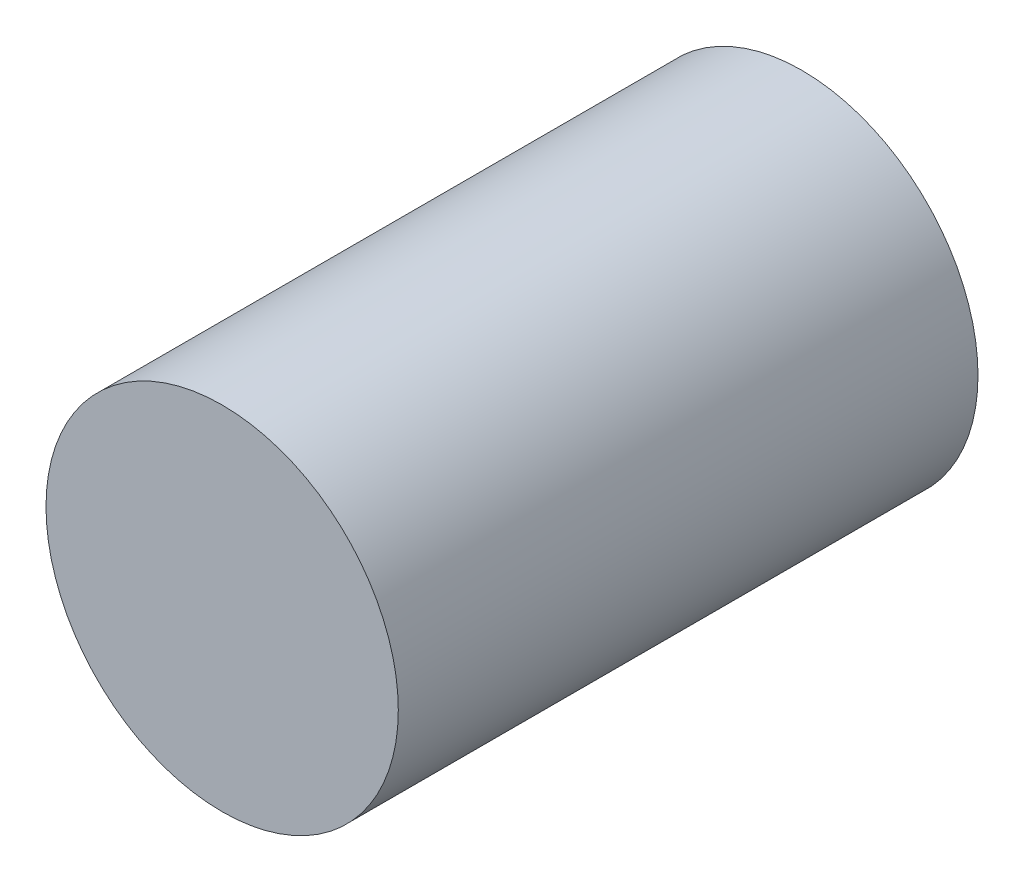
ISO-10303-21;
HEADER;
FILE_DESCRIPTION(('STEP AP214'),'2;1');
FILE_NAME('part.step','',(''),(''),'','','');
FILE_SCHEMA(('AUTOMOTIVE_DESIGN { 1 0 10303 214 1 1 1 1 }'));
ENDSEC;
DATA;
#1=APPLICATION_CONTEXT('core data for automotive mechanical design processes');
#2=APPLICATION_PROTOCOL_DEFINITION('international standard','automotive_design',2000,#1);
#3=PRODUCT_CONTEXT('',#1,'mechanical');
#4=PRODUCT('Part','Part','',(#3));
#5=PRODUCT_RELATED_PRODUCT_CATEGORY('part','',(#4));
#6=PRODUCT_DEFINITION_FORMATION('','',#4);
#7=PRODUCT_DEFINITION_CONTEXT('part definition',#1,'design');
#8=PRODUCT_DEFINITION('design','',#6,#7);
#9=PRODUCT_DEFINITION_SHAPE('','',#8);
#10=(LENGTH_UNIT() NAMED_UNIT(*) SI_UNIT(.MILLI.,.METRE.));
#11=(NAMED_UNIT(*) PLANE_ANGLE_UNIT() SI_UNIT($,.RADIAN.));
#12=(NAMED_UNIT(*) SI_UNIT($,.STERADIAN.) SOLID_ANGLE_UNIT());
#13=UNCERTAINTY_MEASURE_WITH_UNIT(LENGTH_MEASURE(1.E-05),#10,'distance_accuracy_value','');
#14=(GEOMETRIC_REPRESENTATION_CONTEXT(3) GLOBAL_UNCERTAINTY_ASSIGNED_CONTEXT((#13)) GLOBAL_UNIT_ASSIGNED_CONTEXT((#10,
#11,#12)) REPRESENTATION_CONTEXT('',''));
#15=CARTESIAN_POINT('',(0.,0.,0.));
#16=DIRECTION('',(0.,0.,1.));
#17=DIRECTION('',(1.,0.,0.));
#18=AXIS2_PLACEMENT_3D('',#15,#16,#17);
#19=CARTESIAN_POINT('',(0.,0.,36.2));
#20=DIRECTION('',(0.,0.,-1.));
#21=DIRECTION('',(-1.,0.,0.));
#22=AXIS2_PLACEMENT_3D('',#19,#20,#21);
#23=CYLINDRICAL_SURFACE('',#22,11.);
#24=CARTESIAN_POINT('',(0.,0.,36.2));
#25=DIRECTION('',(0.,0.,1.));
#26=DIRECTION('',(1.,0.,0.));
#27=AXIS2_PLACEMENT_3D('',#24,#25,#26);
#28=CIRCLE('',#27,11.);
#29=CARTESIAN_POINT('',(-11.,0.,36.2));
#30=VERTEX_POINT('',#29);
#31=EDGE_CURVE('E10',#30,#30,#28,.T.);
#32=CARTESIAN_POINT('',(0.,0.,0.));
#33=DIRECTION('',(0.,0.,1.));
#34=DIRECTION('',(1.,0.,0.));
#35=AXIS2_PLACEMENT_3D('',#32,#33,#34);
#36=CIRCLE('',#35,11.);
#37=CARTESIAN_POINT('',(-11.,0.,0.));
#38=VERTEX_POINT('',#37);
#39=EDGE_CURVE('E42',#38,#38,#36,.T.);
#40=CARTESIAN_POINT('',(-11.,0.,36.2));
#41=CARTESIAN_POINT('',(-11.,0.,35.8229166666667));
#42=CARTESIAN_POINT('',(-11.,0.,35.4458333333333));
#43=CARTESIAN_POINT('',(-11.,0.,34.6916666666667));
#44=CARTESIAN_POINT('',(-11.,0.,34.3145833333333));
#45=CARTESIAN_POINT('',(-11.,0.,33.5604166666667));
#46=CARTESIAN_POINT('',(-11.,0.,33.1833333333333));
#47=CARTESIAN_POINT('',(-11.,0.,32.4291666666667));
#48=CARTESIAN_POINT('',(-11.,0.,32.0520833333333));
#49=CARTESIAN_POINT('',(-11.,0.,31.2979166666667));
#50=CARTESIAN_POINT('',(-11.,0.,30.9208333333333));
#51=CARTESIAN_POINT('',(-11.,0.,30.1666666666667));
#52=CARTESIAN_POINT('',(-11.,0.,29.7895833333333));
#53=CARTESIAN_POINT('',(-11.,0.,29.0354166666667));
#54=CARTESIAN_POINT('',(-11.,0.,28.6583333333333));
#55=CARTESIAN_POINT('',(-11.,0.,27.9041666666667));
#56=CARTESIAN_POINT('',(-11.,0.,27.5270833333333));
#57=CARTESIAN_POINT('',(-11.,0.,26.7729166666667));
#58=CARTESIAN_POINT('',(-11.,0.,26.3958333333333));
#59=CARTESIAN_POINT('',(-11.,0.,25.6416666666667));
#60=CARTESIAN_POINT('',(-11.,0.,25.2645833333333));
#61=CARTESIAN_POINT('',(-11.,0.,24.5104166666667));
#62=CARTESIAN_POINT('',(-11.,0.,24.1333333333333));
#63=CARTESIAN_POINT('',(-11.,0.,23.3791666666667));
#64=CARTESIAN_POINT('',(-11.,0.,23.0020833333333));
#65=CARTESIAN_POINT('',(-11.,0.,22.2479166666667));
#66=CARTESIAN_POINT('',(-11.,0.,21.8708333333333));
#67=CARTESIAN_POINT('',(-11.,0.,21.1166666666667));
#68=CARTESIAN_POINT('',(-11.,0.,20.7395833333333));
#69=CARTESIAN_POINT('',(-11.,0.,19.9854166666667));
#70=CARTESIAN_POINT('',(-11.,0.,19.6083333333333));
#71=CARTESIAN_POINT('',(-11.,0.,18.8541666666667));
#72=CARTESIAN_POINT('',(-11.,0.,18.4770833333333));
#73=CARTESIAN_POINT('',(-11.,0.,17.7229166666667));
#74=CARTESIAN_POINT('',(-11.,0.,17.3458333333333));
#75=CARTESIAN_POINT('',(-11.,0.,16.5916666666667));
#76=CARTESIAN_POINT('',(-11.,0.,16.2145833333333));
#77=CARTESIAN_POINT('',(-11.,0.,15.4604166666667));
#78=CARTESIAN_POINT('',(-11.,0.,15.0833333333333));
#79=CARTESIAN_POINT('',(-11.,0.,14.3291666666667));
#80=CARTESIAN_POINT('',(-11.,0.,13.9520833333333));
#81=CARTESIAN_POINT('',(-11.,0.,13.1979166666667));
#82=CARTESIAN_POINT('',(-11.,0.,12.8208333333333));
#83=CARTESIAN_POINT('',(-11.,0.,12.0666666666667));
#84=CARTESIAN_POINT('',(-11.,0.,11.6895833333333));
#85=CARTESIAN_POINT('',(-11.,0.,10.9354166666667));
#86=CARTESIAN_POINT('',(-11.,0.,10.5583333333333));
#87=CARTESIAN_POINT('',(-11.,0.,9.80416666666666));
#88=CARTESIAN_POINT('',(-11.,0.,9.42708333333333));
#89=CARTESIAN_POINT('',(-11.,0.,8.67291666666666));
#90=CARTESIAN_POINT('',(-11.,0.,8.29583333333333));
#91=CARTESIAN_POINT('',(-11.,0.,7.54166666666666));
#92=CARTESIAN_POINT('',(-11.,0.,7.16458333333333));
#93=CARTESIAN_POINT('',(-11.,0.,6.41041666666666));
#94=CARTESIAN_POINT('',(-11.,0.,6.03333333333333));
#95=CARTESIAN_POINT('',(-11.,0.,5.27916666666666));
#96=CARTESIAN_POINT('',(-11.,0.,4.90208333333333));
#97=CARTESIAN_POINT('',(-11.,0.,4.14791666666667));
#98=CARTESIAN_POINT('',(-11.,0.,3.77083333333333));
#99=CARTESIAN_POINT('',(-11.,0.,3.01666666666667));
#100=CARTESIAN_POINT('',(-11.,0.,2.63958333333333));
#101=CARTESIAN_POINT('',(-11.,0.,1.88541666666667));
#102=CARTESIAN_POINT('',(-11.,0.,1.50833333333333));
#103=CARTESIAN_POINT('',(-11.,0.,0.754166666666667));
#104=CARTESIAN_POINT('',(-11.,0.,0.377083333333334));
#105=CARTESIAN_POINT('',(-11.,0.,0.));
#106=B_SPLINE_CURVE_WITH_KNOTS('',3,(#40,#41,#42,#43,#44,#45,#46,#47,#48,#49,#50,#51,#52,#53,
#54,#55,#56,#57,#58,#59,#60,#61,#62,#63,#64,#65,#66,#67,#68,#69,#70,#71,#72,#73,#74,#75,#76,#77,
#78,#79,#80,#81,#82,#83,#84,#85,#86,#87,#88,#89,#90,#91,#92,#93,#94,#95,#96,#97,#98,#99,#100,
#101,#102,#103,#104,#105),.UNSPECIFIED.,.F.,.F.,(4,2,2,2,2,2,2,2,2,2,2,2,2,2,2,2,2,2,2,2,2,2,2,
2,2,2,2,2,2,2,2,2,4),(0.,1.13125,2.2625,3.39375,4.525,5.65625000000001,6.7875,7.91875,9.05,
10.18125,11.3125,12.44375,13.575,14.70625,15.8375,16.96875,18.1,19.23125,20.3625,21.49375,
22.625,23.75625,24.8875,26.01875,27.15,28.28125,29.4125,30.54375,31.675,32.80625,33.9375,
35.06875,36.2),.UNSPECIFIED.);
#107=EDGE_CURVE('BSEAM39',#30,#38,#106,.T.);
#108=ORIENTED_EDGE('',*,*,#31,.F.);
#109=ORIENTED_EDGE('',*,*,#39,.T.);
#110=ORIENTED_EDGE('',*,*,#107,.T.);
#111=ORIENTED_EDGE('',*,*,#107,.F.);
#112=EDGE_LOOP('',(#108,#110,#109,#111));
#113=FACE_BOUND('',#112,.T.);
#114=ADVANCED_FACE('F39',(#113),#23,.T.);
#115=CARTESIAN_POINT('',(0.,0.,36.2));
#116=DIRECTION('',(0.,0.,1.));
#117=DIRECTION('',(1.,0.,0.));
#118=AXIS2_PLACEMENT_3D('',#115,#116,#117);
#119=PLANE('',#118);
#120=ORIENTED_EDGE('',*,*,#31,.T.);
#121=EDGE_LOOP('',(#120));
#122=FACE_BOUND('',#121,.T.);
#123=ADVANCED_FACE('F56',(#122),#119,.T.);
#124=CARTESIAN_POINT('',(0.,0.,0.));
#125=DIRECTION('',(0.,0.,1.));
#126=DIRECTION('',(1.,0.,0.));
#127=AXIS2_PLACEMENT_3D('',#124,#125,#126);
#128=PLANE('',#127);
#129=ORIENTED_EDGE('',*,*,#39,.F.);
#130=EDGE_LOOP('',(#129));
#131=FACE_BOUND('',#130,.T.);
#132=ADVANCED_FACE('F54',(#131),#128,.F.);
#133=CLOSED_SHELL('',(#114,#123,#132));
#134=MANIFOLD_SOLID_BREP('B2',#133);
#135=ADVANCED_BREP_SHAPE_REPRESENTATION('',(#18,#134),#14);
#136=SHAPE_DEFINITION_REPRESENTATION(#9,#135);
ENDSEC;
END-ISO-10303-21;
